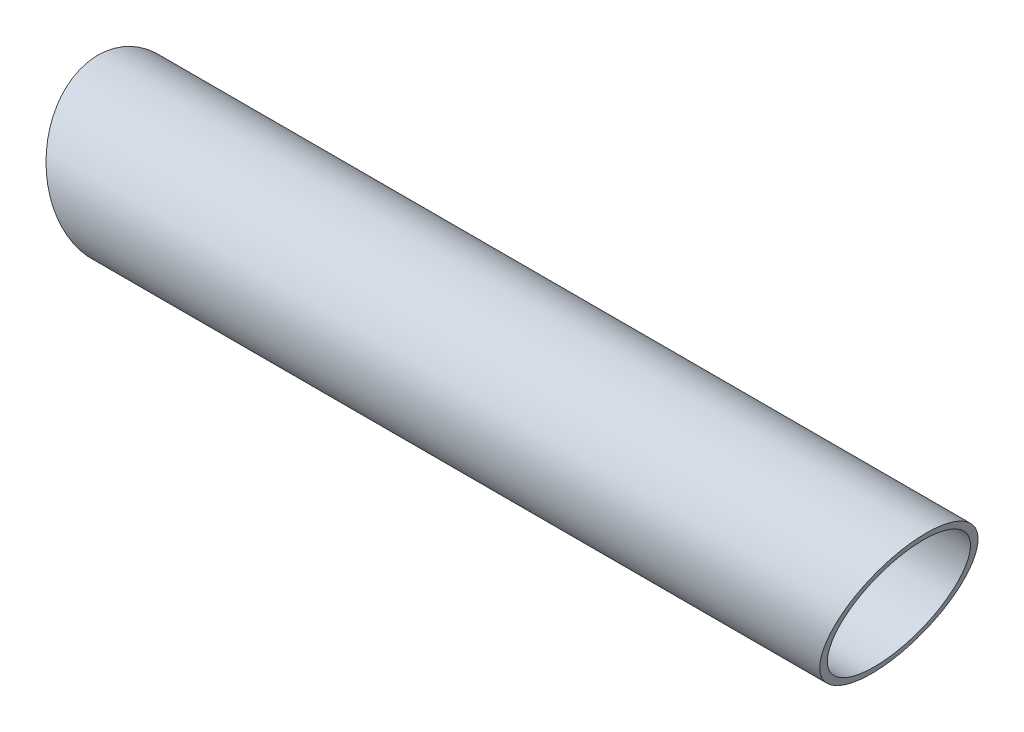
ISO-10303-21;
HEADER;
FILE_DESCRIPTION(('STEP AP214'),'2;1');
FILE_NAME('part.step','',(''),(''),'','','');
FILE_SCHEMA(('AUTOMOTIVE_DESIGN { 1 0 10303 214 1 1 1 1 }'));
ENDSEC;
DATA;
#1=APPLICATION_CONTEXT('core data for automotive mechanical design processes');
#2=APPLICATION_PROTOCOL_DEFINITION('international standard','automotive_design',2000,#1);
#3=PRODUCT_CONTEXT('',#1,'mechanical');
#4=PRODUCT('Part','Part','',(#3));
#5=PRODUCT_RELATED_PRODUCT_CATEGORY('part','',(#4));
#6=PRODUCT_DEFINITION_FORMATION('','',#4);
#7=PRODUCT_DEFINITION_CONTEXT('part definition',#1,'design');
#8=PRODUCT_DEFINITION('design','',#6,#7);
#9=PRODUCT_DEFINITION_SHAPE('','',#8);
#10=(LENGTH_UNIT() NAMED_UNIT(*) SI_UNIT(.MILLI.,.METRE.));
#11=(NAMED_UNIT(*) PLANE_ANGLE_UNIT() SI_UNIT($,.RADIAN.));
#12=(NAMED_UNIT(*) SI_UNIT($,.STERADIAN.) SOLID_ANGLE_UNIT());
#13=UNCERTAINTY_MEASURE_WITH_UNIT(LENGTH_MEASURE(1.E-05),#10,'distance_accuracy_value','');
#14=(GEOMETRIC_REPRESENTATION_CONTEXT(3) GLOBAL_UNCERTAINTY_ASSIGNED_CONTEXT((#13)) GLOBAL_UNIT_ASSIGNED_CONTEXT((#10,
#11,#12)) REPRESENTATION_CONTEXT('',''));
#15=CARTESIAN_POINT('',(0.,0.,0.));
#16=DIRECTION('',(0.,0.,1.));
#17=DIRECTION('',(1.,0.,0.));
#18=AXIS2_PLACEMENT_3D('',#15,#16,#17);
#19=CARTESIAN_POINT('',(-65.0000000000001,580.,-1140.));
#20=DIRECTION('',(1.,0.,0.));
#21=DIRECTION('',(0.,0.,-1.));
#22=AXIS2_PLACEMENT_3D('',#19,#20,#21);
#23=CYLINDRICAL_SURFACE('',#22,11.3);
#24=CARTESIAN_POINT('',(-64.9999999999999,580.,-1140.));
#25=DIRECTION('',(-0.939391078868926,-0.342847489332319,0.));
#26=DIRECTION('',(0.342847489332319,-0.939391078868926,0.));
#27=AXIS2_PLACEMENT_3D('',#24,#25,#26);
#28=ELLIPSE('',#27,12.0290688874816,11.3);
#29=CARTESIAN_POINT('',(-60.8758639329213,568.7,-1140.));
#30=VERTEX_POINT('',#29);
#31=EDGE_CURVE('E53',#30,#30,#28,.T.);
#32=ORIENTED_EDGE('',*,*,#31,.T.);
#33=EDGE_LOOP('',(#32));
#34=FACE_BOUND('',#33,.T.);
#35=CARTESIAN_POINT('',(64.9999999999999,580.,-1140.));
#36=DIRECTION('',(0.939391078868926,-0.342847489332319,0.));
#37=DIRECTION('',(0.342847489332319,0.939391078868926,0.));
#38=AXIS2_PLACEMENT_3D('',#35,#36,#37);
#39=ELLIPSE('',#38,12.0290688874816,11.3);
#40=CARTESIAN_POINT('',(69.1241360670785,591.3,-1140.));
#41=VERTEX_POINT('',#40);
#42=EDGE_CURVE('E43',#41,#41,#39,.T.);
#43=ORIENTED_EDGE('',*,*,#42,.T.);
#44=EDGE_LOOP('',(#43));
#45=FACE_BOUND('',#44,.T.);
#46=ADVANCED_FACE('F39',(#34,#45),#23,.F.);
#47=CARTESIAN_POINT('',(-65.0000000000001,580.,-1140.));
#48=DIRECTION('',(1.,0.,0.));
#49=DIRECTION('',(0.,0.,-1.));
#50=AXIS2_PLACEMENT_3D('',#47,#48,#49);
#51=CYLINDRICAL_SURFACE('',#50,12.5);
#52=CARTESIAN_POINT('',(-64.9999999999999,580.,-1140.));
#53=DIRECTION('',(-0.939391078868926,-0.342847489332319,0.));
#54=DIRECTION('',(0.342847489332319,-0.939391078868926,0.));
#55=AXIS2_PLACEMENT_3D('',#52,#53,#54);
#56=ELLIPSE('',#55,13.30649213217,12.5);
#57=CARTESIAN_POINT('',(-60.4379025806652,567.5,-1140.));
#58=VERTEX_POINT('',#57);
#59=EDGE_CURVE('E47',#58,#58,#56,.T.);
#60=ORIENTED_EDGE('',*,*,#59,.F.);
#61=EDGE_LOOP('',(#60));
#62=FACE_BOUND('',#61,.T.);
#63=CARTESIAN_POINT('',(64.9999999999999,580.,-1140.));
#64=DIRECTION('',(0.939391078868926,-0.342847489332319,0.));
#65=DIRECTION('',(0.342847489332319,0.939391078868926,0.));
#66=AXIS2_PLACEMENT_3D('',#63,#64,#65);
#67=ELLIPSE('',#66,13.30649213217,12.5);
#68=CARTESIAN_POINT('',(69.5620974193346,592.5,-1140.));
#69=VERTEX_POINT('',#68);
#70=EDGE_CURVE('E10',#69,#69,#67,.T.);
#71=ORIENTED_EDGE('',*,*,#70,.F.);
#72=EDGE_LOOP('',(#71));
#73=FACE_BOUND('',#72,.T.);
#74=ADVANCED_FACE('F67',(#62,#73),#51,.T.);
#75=CARTESIAN_POINT('',(-65.,580.,-1140.));
#76=DIRECTION('',(-0.939391078868926,-0.342847489332319,0.));
#77=DIRECTION('',(0.342847489332319,-0.939391078868926,0.));
#78=AXIS2_PLACEMENT_3D('',#75,#76,#77);
#79=PLANE('',#78);
#80=ORIENTED_EDGE('',*,*,#31,.F.);
#81=EDGE_LOOP('',(#80));
#82=FACE_BOUND('',#81,.T.);
#83=ORIENTED_EDGE('',*,*,#59,.T.);
#84=EDGE_LOOP('',(#83));
#85=FACE_BOUND('',#84,.T.);
#86=ADVANCED_FACE('F62',(#82,#85),#79,.T.);
#87=CARTESIAN_POINT('',(65.,580.,-1140.));
#88=DIRECTION('',(0.939391078868926,-0.342847489332319,0.));
#89=DIRECTION('',(0.342847489332319,0.939391078868926,0.));
#90=AXIS2_PLACEMENT_3D('',#87,#88,#89);
#91=PLANE('',#90);
#92=ORIENTED_EDGE('',*,*,#42,.F.);
#93=EDGE_LOOP('',(#92));
#94=FACE_BOUND('',#93,.T.);
#95=ORIENTED_EDGE('',*,*,#70,.T.);
#96=EDGE_LOOP('',(#95));
#97=FACE_BOUND('',#96,.T.);
#98=ADVANCED_FACE('F41',(#94,#97),#91,.T.);
#99=CLOSED_SHELL('',(#46,#74,#86,#98));
#100=MANIFOLD_SOLID_BREP('B2',#99);
#101=ADVANCED_BREP_SHAPE_REPRESENTATION('',(#18,#100),#14);
#102=SHAPE_DEFINITION_REPRESENTATION(#9,#101);
ENDSEC;
END-ISO-10303-21;
